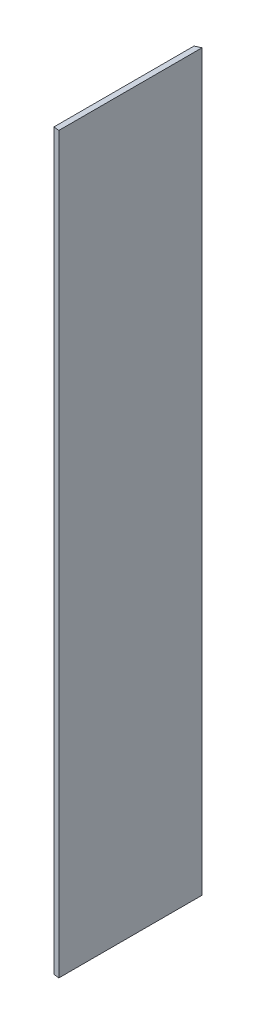
ISO-10303-21;
HEADER;
FILE_DESCRIPTION(('STEP AP214'),'2;1');
FILE_NAME('part.step','',(''),(''),'','','');
FILE_SCHEMA(('AUTOMOTIVE_DESIGN { 1 0 10303 214 1 1 1 1 }'));
ENDSEC;
DATA;
#1=APPLICATION_CONTEXT('core data for automotive mechanical design processes');
#2=APPLICATION_PROTOCOL_DEFINITION('international standard','automotive_design',2000,#1);
#3=PRODUCT_CONTEXT('',#1,'mechanical');
#4=PRODUCT('Part','Part','',(#3));
#5=PRODUCT_RELATED_PRODUCT_CATEGORY('part','',(#4));
#6=PRODUCT_DEFINITION_FORMATION('','',#4);
#7=PRODUCT_DEFINITION_CONTEXT('part definition',#1,'design');
#8=PRODUCT_DEFINITION('design','',#6,#7);
#9=PRODUCT_DEFINITION_SHAPE('','',#8);
#10=(LENGTH_UNIT() NAMED_UNIT(*) SI_UNIT(.MILLI.,.METRE.));
#11=(NAMED_UNIT(*) PLANE_ANGLE_UNIT() SI_UNIT($,.RADIAN.));
#12=(NAMED_UNIT(*) SI_UNIT($,.STERADIAN.) SOLID_ANGLE_UNIT());
#13=UNCERTAINTY_MEASURE_WITH_UNIT(LENGTH_MEASURE(1.E-05),#10,'distance_accuracy_value','');
#14=(GEOMETRIC_REPRESENTATION_CONTEXT(3) GLOBAL_UNCERTAINTY_ASSIGNED_CONTEXT((#13)) GLOBAL_UNIT_ASSIGNED_CONTEXT((#10,
#11,#12)) REPRESENTATION_CONTEXT('',''));
#15=CARTESIAN_POINT('',(0.,0.,0.));
#16=DIRECTION('',(0.,0.,1.));
#17=DIRECTION('',(1.,0.,0.));
#18=AXIS2_PLACEMENT_3D('',#15,#16,#17);
#19=CARTESIAN_POINT('',(5.02637904605247,637.365803995151,3.7635081833482));
#20=DIRECTION('',(0.408416038201876,0.,0.912795891609665));
#21=DIRECTION('',(0.912795891609665,0.,-0.408416038201876));
#22=AXIS2_PLACEMENT_3D('',#19,#20,#21);
#23=PLANE('',#22);
#24=DIRECTION('',(-0.912795891609665,0.,0.408416038201876));
#25=VECTOR('',#24,1.);
#26=CARTESIAN_POINT('',(5.02637904605246,533.213673316679,3.7635081833482));
#27=LINE('',#26,#25);
#28=CARTESIAN_POINT('',(5.02637904605247,533.213673316679,3.7635081833482));
#29=VERTEX_POINT('',#28);
#30=CARTESIAN_POINT('',(1.02637904605246,533.213673316679,5.55324471461876));
#31=VERTEX_POINT('',#30);
#32=EDGE_CURVE('E81',#29,#31,#27,.T.);
#33=ORIENTED_EDGE('',*,*,#32,.F.);
#34=DIRECTION('',(0.,-1.,0.));
#35=VECTOR('',#34,1.);
#36=CARTESIAN_POINT('',(5.02637904605247,637.365803995151,3.7635081833482));
#37=LINE('',#36,#35);
#38=CARTESIAN_POINT('',(5.02637904605247,0.,3.7635081833482));
#39=VERTEX_POINT('',#38);
#40=EDGE_CURVE('E35',#29,#39,#37,.T.);
#41=ORIENTED_EDGE('',*,*,#40,.T.);
#42=DIRECTION('',(-0.912795891609665,0.,0.408416038201876));
#43=VECTOR('',#42,1.);
#44=CARTESIAN_POINT('',(5.02637904605247,0.,3.7635081833482));
#45=LINE('',#44,#43);
#46=CARTESIAN_POINT('',(1.02637904605246,0.,5.55324471461876));
#47=VERTEX_POINT('',#46);
#48=EDGE_CURVE('E79',#39,#47,#45,.T.);
#49=ORIENTED_EDGE('',*,*,#48,.T.);
#50=DIRECTION('',(0.,-1.,0.));
#51=VECTOR('',#50,1.);
#52=CARTESIAN_POINT('',(1.02637904605246,637.365803995151,5.55324471461876));
#53=LINE('',#52,#51);
#54=EDGE_CURVE('E70',#31,#47,#53,.T.);
#55=ORIENTED_EDGE('',*,*,#54,.F.);
#56=EDGE_LOOP('',(#33,#41,#49,#55));
#57=FACE_BOUND('',#56,.T.);
#58=ADVANCED_FACE('F31',(#57),#23,.F.);
#59=CARTESIAN_POINT('',(1.02637904605246,637.365803995151,5.55324471461876));
#60=DIRECTION('',(1.,0.,0.));
#61=DIRECTION('',(0.,0.,-1.));
#62=AXIS2_PLACEMENT_3D('',#59,#60,#61);
#63=PLANE('',#62);
#64=DIRECTION('',(0.,0.,1.));
#65=VECTOR('',#64,1.);
#66=CARTESIAN_POINT('',(1.02637904605246,533.213673316679,5.55324471461875));
#67=LINE('',#66,#65);
#68=CARTESIAN_POINT('',(1.02637904605248,533.213673316679,107.324896907544));
#69=VERTEX_POINT('',#68);
#70=EDGE_CURVE('E40',#31,#69,#67,.T.);
#71=ORIENTED_EDGE('',*,*,#70,.F.);
#72=ORIENTED_EDGE('',*,*,#54,.T.);
#73=DIRECTION('',(0.,0.,1.));
#74=VECTOR('',#73,1.);
#75=CARTESIAN_POINT('',(1.02637904605246,0.,5.55324471461876));
#76=LINE('',#75,#74);
#77=CARTESIAN_POINT('',(1.02637904605248,0.,107.324896907544));
#78=VERTEX_POINT('',#77);
#79=EDGE_CURVE('E91',#47,#78,#76,.T.);
#80=ORIENTED_EDGE('',*,*,#79,.T.);
#81=DIRECTION('',(0.,-1.,0.));
#82=VECTOR('',#81,1.);
#83=CARTESIAN_POINT('',(1.02637904605248,637.365803995151,107.324896907544));
#84=LINE('',#83,#82);
#85=EDGE_CURVE('E100',#69,#78,#84,.T.);
#86=ORIENTED_EDGE('',*,*,#85,.F.);
#87=EDGE_LOOP('',(#71,#72,#80,#86));
#88=FACE_BOUND('',#87,.T.);
#89=ADVANCED_FACE('F104',(#88),#63,.F.);
#90=CARTESIAN_POINT('',(1.02637904605248,637.365803995151,107.324896907544));
#91=DIRECTION('',(0.12742836011959,0.,-0.991847777149917));
#92=DIRECTION('',(-0.991847777149917,0.,-0.12742836011959));
#93=AXIS2_PLACEMENT_3D('',#90,#91,#92);
#94=PLANE('',#93);
#95=DIRECTION('',(0.991847777149917,0.,0.12742836011959));
#96=VECTOR('',#95,1.);
#97=CARTESIAN_POINT('',(1.02637904605247,533.213673316679,107.324896907544));
#98=LINE('',#97,#96);
#99=CARTESIAN_POINT('',(5.02637904605247,533.213673316679,107.838799798916));
#100=VERTEX_POINT('',#99);
#101=EDGE_CURVE('E11',#69,#100,#98,.T.);
#102=ORIENTED_EDGE('',*,*,#101,.F.);
#103=ORIENTED_EDGE('',*,*,#85,.T.);
#104=DIRECTION('',(0.991847777149917,0.,0.12742836011959));
#105=VECTOR('',#104,1.);
#106=CARTESIAN_POINT('',(1.02637904605248,0.,107.324896907544));
#107=LINE('',#106,#105);
#108=CARTESIAN_POINT('',(5.02637904605247,0.,107.838799798916));
#109=VERTEX_POINT('',#108);
#110=EDGE_CURVE('E101',#78,#109,#107,.T.);
#111=ORIENTED_EDGE('',*,*,#110,.T.);
#112=DIRECTION('',(0.,-1.,0.));
#113=VECTOR('',#112,1.);
#114=CARTESIAN_POINT('',(5.02637904605247,637.365803995151,107.838799798916));
#115=LINE('',#114,#113);
#116=EDGE_CURVE('E53',#100,#109,#115,.T.);
#117=ORIENTED_EDGE('',*,*,#116,.F.);
#118=EDGE_LOOP('',(#102,#103,#111,#117));
#119=FACE_BOUND('',#118,.T.);
#120=ADVANCED_FACE('F103',(#119),#94,.F.);
#121=CARTESIAN_POINT('',(5.02637904605247,637.365803995151,107.838799798916));
#122=DIRECTION('',(-1.,0.,0.));
#123=DIRECTION('',(0.,0.,1.));
#124=AXIS2_PLACEMENT_3D('',#121,#122,#123);
#125=PLANE('',#124);
#126=DIRECTION('',(0.,0.,-1.));
#127=VECTOR('',#126,1.);
#128=CARTESIAN_POINT('',(5.02637904605247,533.213673316679,107.838799798916));
#129=LINE('',#128,#127);
#130=EDGE_CURVE('E88',#100,#29,#129,.T.);
#131=ORIENTED_EDGE('',*,*,#130,.F.);
#132=ORIENTED_EDGE('',*,*,#116,.T.);
#133=DIRECTION('',(0.,0.,-1.));
#134=VECTOR('',#133,1.);
#135=CARTESIAN_POINT('',(5.02637904605247,0.,107.838799798916));
#136=LINE('',#135,#134);
#137=EDGE_CURVE('E84',#109,#39,#136,.T.);
#138=ORIENTED_EDGE('',*,*,#137,.T.);
#139=ORIENTED_EDGE('',*,*,#40,.F.);
#140=EDGE_LOOP('',(#131,#132,#138,#139));
#141=FACE_BOUND('',#140,.T.);
#142=ADVANCED_FACE('F85',(#141),#125,.F.);
#143=CARTESIAN_POINT('',(1.02637904605246,0.,5.55324471461876));
#144=DIRECTION('',(0.,1.,0.));
#145=DIRECTION('',(0.,0.,1.));
#146=AXIS2_PLACEMENT_3D('',#143,#144,#145);
#147=PLANE('',#146);
#148=ORIENTED_EDGE('',*,*,#48,.F.);
#149=ORIENTED_EDGE('',*,*,#137,.F.);
#150=ORIENTED_EDGE('',*,*,#110,.F.);
#151=ORIENTED_EDGE('',*,*,#79,.F.);
#152=EDGE_LOOP('',(#148,#149,#150,#151));
#153=FACE_BOUND('',#152,.T.);
#154=ADVANCED_FACE('F90',(#153),#147,.F.);
#155=CARTESIAN_POINT('',(-157.897483649013,533.213673316679,25.5300025529366));
#156=DIRECTION('',(0.,1.,0.));
#157=DIRECTION('',(-0.759435060713234,0.,-0.65058311425942));
#158=AXIS2_PLACEMENT_3D('',#155,#156,#157);
#159=PLANE('',#158);
#160=ORIENTED_EDGE('',*,*,#130,.T.);
#161=ORIENTED_EDGE('',*,*,#32,.T.);
#162=ORIENTED_EDGE('',*,*,#70,.T.);
#163=ORIENTED_EDGE('',*,*,#101,.T.);
#164=EDGE_LOOP('',(#160,#161,#162,#163));
#165=FACE_BOUND('',#164,.T.);
#166=ADVANCED_FACE('F33',(#165),#159,.T.);
#167=CLOSED_SHELL('',(#58,#89,#120,#142,#154,#166));
#168=MANIFOLD_SOLID_BREP('B2',#167);
#169=ADVANCED_BREP_SHAPE_REPRESENTATION('',(#18,#168),#14);
#170=SHAPE_DEFINITION_REPRESENTATION(#9,#169);
ENDSEC;
END-ISO-10303-21;
